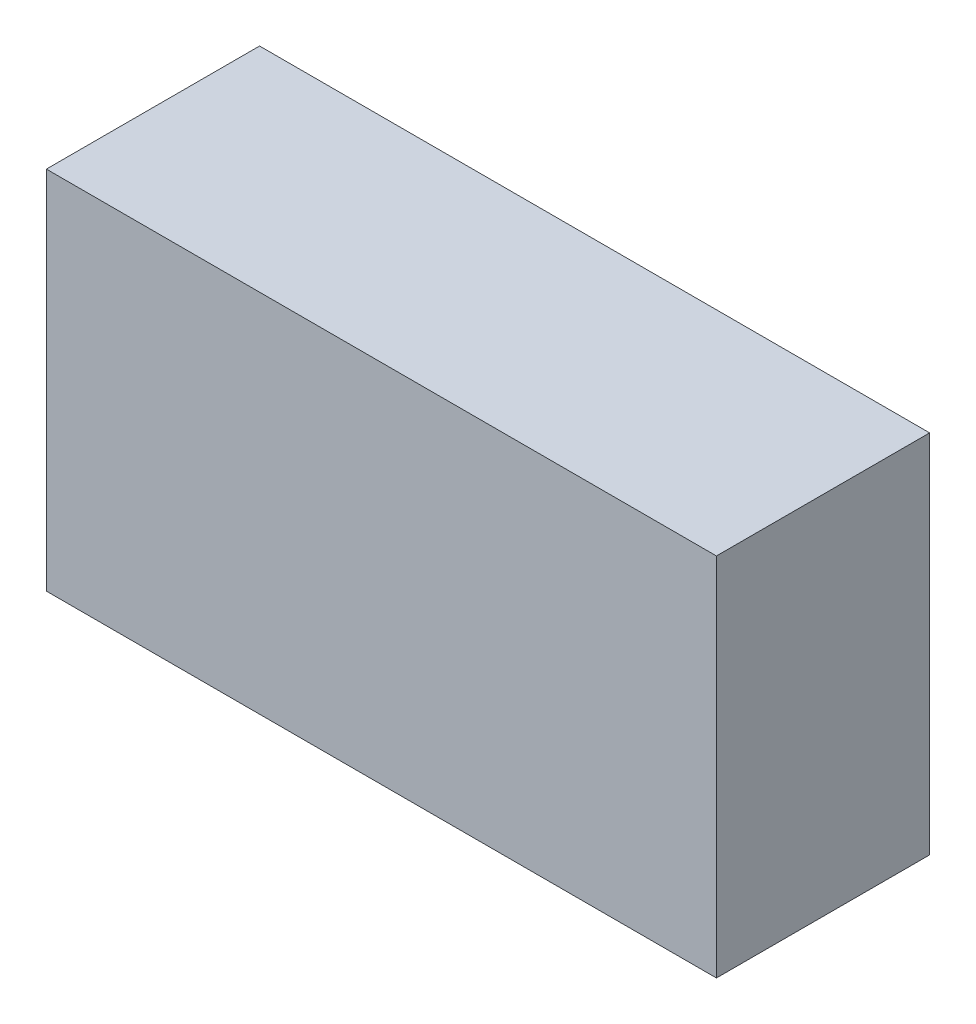
ISO-10303-21;
HEADER;
FILE_DESCRIPTION(('STEP AP214'),'2;1');
FILE_NAME('part.step','',(''),(''),'','','');
FILE_SCHEMA(('AUTOMOTIVE_DESIGN { 1 0 10303 214 1 1 1 1 }'));
ENDSEC;
DATA;
#1=APPLICATION_CONTEXT('core data for automotive mechanical design processes');
#2=APPLICATION_PROTOCOL_DEFINITION('international standard','automotive_design',2000,#1);
#3=PRODUCT_CONTEXT('',#1,'mechanical');
#4=PRODUCT('Part','Part','',(#3));
#5=PRODUCT_RELATED_PRODUCT_CATEGORY('part','',(#4));
#6=PRODUCT_DEFINITION_FORMATION('','',#4);
#7=PRODUCT_DEFINITION_CONTEXT('part definition',#1,'design');
#8=PRODUCT_DEFINITION('design','',#6,#7);
#9=PRODUCT_DEFINITION_SHAPE('','',#8);
#10=(LENGTH_UNIT() NAMED_UNIT(*) SI_UNIT(.MILLI.,.METRE.));
#11=(NAMED_UNIT(*) PLANE_ANGLE_UNIT() SI_UNIT($,.RADIAN.));
#12=(NAMED_UNIT(*) SI_UNIT($,.STERADIAN.) SOLID_ANGLE_UNIT());
#13=UNCERTAINTY_MEASURE_WITH_UNIT(LENGTH_MEASURE(1.E-05),#10,'distance_accuracy_value','');
#14=(GEOMETRIC_REPRESENTATION_CONTEXT(3) GLOBAL_UNCERTAINTY_ASSIGNED_CONTEXT((#13)) GLOBAL_UNIT_ASSIGNED_CONTEXT((#10,
#11,#12)) REPRESENTATION_CONTEXT('',''));
#15=CARTESIAN_POINT('',(0.,0.,0.));
#16=DIRECTION('',(0.,0.,1.));
#17=DIRECTION('',(1.,0.,0.));
#18=AXIS2_PLACEMENT_3D('',#15,#16,#17);
#19=CARTESIAN_POINT('',(0.,0.,0.35001));
#20=DIRECTION('',(0.,0.,1.));
#21=DIRECTION('',(1.,0.,0.));
#22=AXIS2_PLACEMENT_3D('',#19,#20,#21);
#23=PLANE('',#22);
#24=DIRECTION('',(1.,0.,0.));
#25=VECTOR('',#24,1.);
#26=CARTESIAN_POINT('',(-0.55004,-0.30004,0.35001));
#27=LINE('',#26,#25);
#28=CARTESIAN_POINT('',(-0.55004,-0.30004,0.35001));
#29=VERTEX_POINT('',#28);
#30=CARTESIAN_POINT('',(0.55004,-0.30004,0.35001));
#31=VERTEX_POINT('',#30);
#32=EDGE_CURVE('E85',#29,#31,#27,.T.);
#33=ORIENTED_EDGE('',*,*,#32,.T.);
#34=DIRECTION('',(0.,1.,0.));
#35=VECTOR('',#34,1.);
#36=CARTESIAN_POINT('',(0.55004,-0.30004,0.35001));
#37=LINE('',#36,#35);
#38=CARTESIAN_POINT('',(0.55004,0.30004,0.35001));
#39=VERTEX_POINT('',#38);
#40=EDGE_CURVE('E84',#31,#39,#37,.T.);
#41=ORIENTED_EDGE('',*,*,#40,.T.);
#42=DIRECTION('',(-1.,0.,0.));
#43=VECTOR('',#42,1.);
#44=CARTESIAN_POINT('',(0.55004,0.30004,0.35001));
#45=LINE('',#44,#43);
#46=CARTESIAN_POINT('',(-0.55004,0.30004,0.35001));
#47=VERTEX_POINT('',#46);
#48=EDGE_CURVE('E77',#39,#47,#45,.T.);
#49=ORIENTED_EDGE('',*,*,#48,.T.);
#50=DIRECTION('',(0.,-1.,0.));
#51=VECTOR('',#50,1.);
#52=CARTESIAN_POINT('',(-0.55004,0.30004,0.35001));
#53=LINE('',#52,#51);
#54=EDGE_CURVE('E11',#47,#29,#53,.T.);
#55=ORIENTED_EDGE('',*,*,#54,.T.);
#56=EDGE_LOOP('',(#33,#41,#49,#55));
#57=FACE_BOUND('',#56,.T.);
#58=ADVANCED_FACE('F16',(#57),#23,.T.);
#59=CARTESIAN_POINT('',(0.,0.,0.));
#60=DIRECTION('',(0.,0.,1.));
#61=DIRECTION('',(1.,0.,0.));
#62=AXIS2_PLACEMENT_3D('',#59,#60,#61);
#63=PLANE('',#62);
#64=DIRECTION('',(1.,0.,0.));
#65=VECTOR('',#64,1.);
#66=CARTESIAN_POINT('',(-0.55004,-0.30004,0.));
#67=LINE('',#66,#65);
#68=CARTESIAN_POINT('',(-0.55004,-0.30004,0.));
#69=VERTEX_POINT('',#68);
#70=CARTESIAN_POINT('',(0.55004,-0.30004,0.));
#71=VERTEX_POINT('',#70);
#72=EDGE_CURVE('E106',#69,#71,#67,.T.);
#73=ORIENTED_EDGE('',*,*,#72,.F.);
#74=DIRECTION('',(0.,-1.,0.));
#75=VECTOR('',#74,1.);
#76=CARTESIAN_POINT('',(-0.55004,0.30004,0.));
#77=LINE('',#76,#75);
#78=CARTESIAN_POINT('',(-0.55004,0.30004,0.));
#79=VERTEX_POINT('',#78);
#80=EDGE_CURVE('E27',#79,#69,#77,.T.);
#81=ORIENTED_EDGE('',*,*,#80,.F.);
#82=DIRECTION('',(-1.,0.,0.));
#83=VECTOR('',#82,1.);
#84=CARTESIAN_POINT('',(0.55004,0.30004,0.));
#85=LINE('',#84,#83);
#86=CARTESIAN_POINT('',(0.55004,0.30004,0.));
#87=VERTEX_POINT('',#86);
#88=EDGE_CURVE('E71',#87,#79,#85,.T.);
#89=ORIENTED_EDGE('',*,*,#88,.F.);
#90=DIRECTION('',(0.,1.,0.));
#91=VECTOR('',#90,1.);
#92=CARTESIAN_POINT('',(0.55004,-0.30004,0.));
#93=LINE('',#92,#91);
#94=EDGE_CURVE('E92',#71,#87,#93,.T.);
#95=ORIENTED_EDGE('',*,*,#94,.F.);
#96=EDGE_LOOP('',(#73,#81,#89,#95));
#97=FACE_BOUND('',#96,.T.);
#98=ADVANCED_FACE('F130',(#97),#63,.F.);
#99=CARTESIAN_POINT('',(-0.55004,0.30004,0.));
#100=DIRECTION('',(1.,0.,0.));
#101=DIRECTION('',(0.,1.,0.));
#102=AXIS2_PLACEMENT_3D('',#99,#100,#101);
#103=PLANE('',#102);
#104=DIRECTION('',(0.,0.,1.));
#105=VECTOR('',#104,1.);
#106=CARTESIAN_POINT('',(-0.55004,0.30004,0.));
#107=LINE('',#106,#105);
#108=EDGE_CURVE('E81',#79,#47,#107,.T.);
#109=ORIENTED_EDGE('',*,*,#108,.F.);
#110=ORIENTED_EDGE('',*,*,#80,.T.);
#111=DIRECTION('',(0.,0.,1.));
#112=VECTOR('',#111,1.);
#113=CARTESIAN_POINT('',(-0.55004,-0.30004,0.));
#114=LINE('',#113,#112);
#115=EDGE_CURVE('E104',#69,#29,#114,.T.);
#116=ORIENTED_EDGE('',*,*,#115,.T.);
#117=ORIENTED_EDGE('',*,*,#54,.F.);
#118=EDGE_LOOP('',(#109,#110,#116,#117));
#119=FACE_BOUND('',#118,.T.);
#120=ADVANCED_FACE('F128',(#119),#103,.F.);
#121=CARTESIAN_POINT('',(0.55004,0.30004,0.));
#122=DIRECTION('',(0.,-1.,0.));
#123=DIRECTION('',(0.,0.,-1.));
#124=AXIS2_PLACEMENT_3D('',#121,#122,#123);
#125=PLANE('',#124);
#126=DIRECTION('',(0.,0.,1.));
#127=VECTOR('',#126,1.);
#128=CARTESIAN_POINT('',(0.55004,0.30004,0.));
#129=LINE('',#128,#127);
#130=EDGE_CURVE('E20',#87,#39,#129,.T.);
#131=ORIENTED_EDGE('',*,*,#130,.F.);
#132=ORIENTED_EDGE('',*,*,#88,.T.);
#133=ORIENTED_EDGE('',*,*,#108,.T.);
#134=ORIENTED_EDGE('',*,*,#48,.F.);
#135=EDGE_LOOP('',(#131,#132,#133,#134));
#136=FACE_BOUND('',#135,.T.);
#137=ADVANCED_FACE('F18',(#136),#125,.F.);
#138=CARTESIAN_POINT('',(0.55004,-0.30004,0.));
#139=DIRECTION('',(-1.,0.,0.));
#140=DIRECTION('',(0.,0.,1.));
#141=AXIS2_PLACEMENT_3D('',#138,#139,#140);
#142=PLANE('',#141);
#143=DIRECTION('',(0.,0.,1.));
#144=VECTOR('',#143,1.);
#145=CARTESIAN_POINT('',(0.55004,-0.30004,0.));
#146=LINE('',#145,#144);
#147=EDGE_CURVE('E101',#71,#31,#146,.T.);
#148=ORIENTED_EDGE('',*,*,#147,.F.);
#149=ORIENTED_EDGE('',*,*,#94,.T.);
#150=ORIENTED_EDGE('',*,*,#130,.T.);
#151=ORIENTED_EDGE('',*,*,#40,.F.);
#152=EDGE_LOOP('',(#148,#149,#150,#151));
#153=FACE_BOUND('',#152,.T.);
#154=ADVANCED_FACE('F91',(#153),#142,.F.);
#155=CARTESIAN_POINT('',(-0.55004,-0.30004,0.));
#156=DIRECTION('',(0.,1.,0.));
#157=DIRECTION('',(1.,0.,0.));
#158=AXIS2_PLACEMENT_3D('',#155,#156,#157);
#159=PLANE('',#158);
#160=ORIENTED_EDGE('',*,*,#115,.F.);
#161=ORIENTED_EDGE('',*,*,#72,.T.);
#162=ORIENTED_EDGE('',*,*,#147,.T.);
#163=ORIENTED_EDGE('',*,*,#32,.F.);
#164=EDGE_LOOP('',(#160,#161,#162,#163));
#165=FACE_BOUND('',#164,.T.);
#166=ADVANCED_FACE('F127',(#165),#159,.F.);
#167=CLOSED_SHELL('',(#58,#98,#120,#137,#154,#166));
#168=MANIFOLD_SOLID_BREP('B1',#167);
#169=ADVANCED_BREP_SHAPE_REPRESENTATION('',(#18,#168),#14);
#170=SHAPE_DEFINITION_REPRESENTATION(#9,#169);
ENDSEC;
END-ISO-10303-21;
